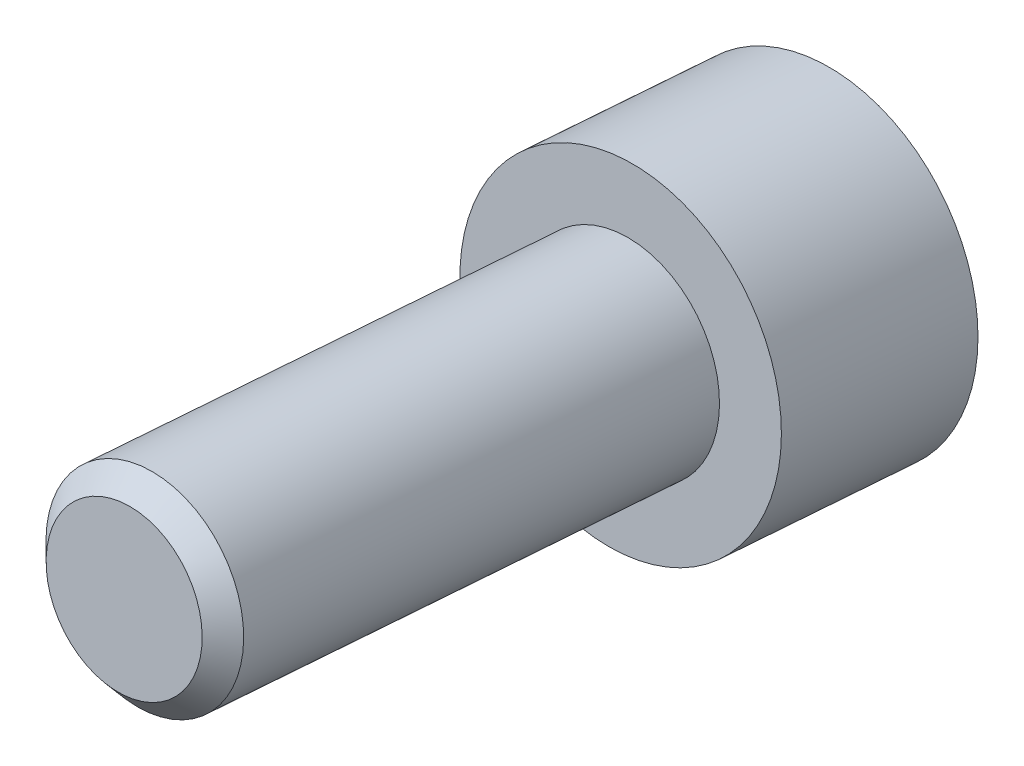
ISO-10303-21;
HEADER;
FILE_DESCRIPTION(('STEP AP214'),'2;1');
FILE_NAME('part.step','',(''),(''),'','','');
FILE_SCHEMA(('AUTOMOTIVE_DESIGN { 1 0 10303 214 1 1 1 1 }'));
ENDSEC;
DATA;
#1=APPLICATION_CONTEXT('core data for automotive mechanical design processes');
#2=APPLICATION_PROTOCOL_DEFINITION('international standard','automotive_design',2000,#1);
#3=PRODUCT_CONTEXT('',#1,'mechanical');
#4=PRODUCT('Part','Part','',(#3));
#5=PRODUCT_RELATED_PRODUCT_CATEGORY('part','',(#4));
#6=PRODUCT_DEFINITION_FORMATION('','',#4);
#7=PRODUCT_DEFINITION_CONTEXT('part definition',#1,'design');
#8=PRODUCT_DEFINITION('design','',#6,#7);
#9=PRODUCT_DEFINITION_SHAPE('','',#8);
#10=(LENGTH_UNIT() NAMED_UNIT(*) SI_UNIT(.MILLI.,.METRE.));
#11=(NAMED_UNIT(*) PLANE_ANGLE_UNIT() SI_UNIT($,.RADIAN.));
#12=(NAMED_UNIT(*) SI_UNIT($,.STERADIAN.) SOLID_ANGLE_UNIT());
#13=UNCERTAINTY_MEASURE_WITH_UNIT(LENGTH_MEASURE(1.E-05),#10,'distance_accuracy_value','');
#14=(GEOMETRIC_REPRESENTATION_CONTEXT(3) GLOBAL_UNCERTAINTY_ASSIGNED_CONTEXT((#13)) GLOBAL_UNIT_ASSIGNED_CONTEXT((#10,
#11,#12)) REPRESENTATION_CONTEXT('',''));
#15=CARTESIAN_POINT('',(0.,0.,0.));
#16=DIRECTION('',(0.,0.,1.));
#17=DIRECTION('',(1.,0.,0.));
#18=AXIS2_PLACEMENT_3D('',#15,#16,#17);
#19=CARTESIAN_POINT('',(-13.0881387525545,28.3949735281638,-38.8736341053796));
#20=DIRECTION('',(0.,-0.0739396993188504,-0.997262714065175));
#21=DIRECTION('',(0.,0.997262714065175,-0.0739396993188504));
#22=AXIS2_PLACEMENT_3D('',#19,#20,#21);
#23=PLANE('',#22);
#24=DIRECTION('',(0.191716471391777,-0.978763842343136,0.0725681439668081));
#25=VECTOR('',#24,1.);
#26=CARTESIAN_POINT('',(-12.8684931328905,27.2736239169617,-38.7904942748071));
#27=LINE('',#26,#25);
#28=CARTESIAN_POINT('',(-12.8684931328905,27.2736239169617,-38.7904942748071));
#29=VERTEX_POINT('',#28);
#30=CARTESIAN_POINT('',(-12.6488475132264,26.1522743057596,-38.7073544442347));
#31=VERTEX_POINT('',#30);
#32=EDGE_CURVE('E68',#29,#31,#27,.T.);
#33=ORIENTED_EDGE('',*,*,#32,.T.);
#34=DIRECTION('',(-0.754102702199386,-0.654958780483957,0.0485603789374805));
#35=VECTOR('',#34,1.);
#36=CARTESIAN_POINT('',(-12.6488475132264,26.1522743057596,-38.7073544442347));
#37=LINE('',#36,#35);
#38=CARTESIAN_POINT('',(-13.5128074751038,25.4019014966345,-38.6517198164668));
#39=VERTEX_POINT('',#38);
#40=EDGE_CURVE('E91',#31,#39,#37,.T.);
#41=ORIENTED_EDGE('',*,*,#40,.T.);
#42=DIRECTION('',(-0.945819173591162,0.323805061859179,-0.0240077650293393));
#43=VECTOR('',#42,1.);
#44=CARTESIAN_POINT('',(-13.5128074751038,25.4019014966345,-38.6517198164668));
#45=LINE('',#44,#43);
#46=CARTESIAN_POINT('',(-14.5964130566453,25.7728782987115,-38.6792250192715));
#47=VERTEX_POINT('',#46);
#48=EDGE_CURVE('E130',#39,#47,#45,.T.);
#49=ORIENTED_EDGE('',*,*,#48,.T.);
#50=DIRECTION('',(-0.191716471391775,0.978763842343137,-0.0725681439667963));
#51=VECTOR('',#50,1.);
#52=CARTESIAN_POINT('',(-14.5964130566453,25.7728782987115,-38.6792250192715));
#53=LINE('',#52,#51);
#54=CARTESIAN_POINT('',(-14.8160586763093,26.8942279099136,-38.7623648498439));
#55=VERTEX_POINT('',#54);
#56=EDGE_CURVE('E125',#47,#55,#53,.T.);
#57=ORIENTED_EDGE('',*,*,#56,.T.);
#58=DIRECTION('',(0.754102702199386,0.654958780483956,-0.0485603789374928));
#59=VECTOR('',#58,1.);
#60=CARTESIAN_POINT('',(-14.8160586763093,26.8942279099136,-38.7623648498439));
#61=LINE('',#60,#59);
#62=CARTESIAN_POINT('',(-13.9520987144319,27.6446007190387,-38.8179994776117));
#63=VERTEX_POINT('',#62);
#64=EDGE_CURVE('E74',#55,#63,#61,.T.);
#65=ORIENTED_EDGE('',*,*,#64,.T.);
#66=DIRECTION('',(0.945819173591162,-0.323805061859179,0.0240077650293395));
#67=VECTOR('',#66,1.);
#68=CARTESIAN_POINT('',(-13.9520987144319,27.6446007190387,-38.8179994776117));
#69=LINE('',#68,#67);
#70=EDGE_CURVE('E71',#63,#29,#69,.T.);
#71=ORIENTED_EDGE('',*,*,#70,.T.);
#72=EDGE_LOOP('',(#33,#41,#49,#57,#65,#71));
#73=FACE_BOUND('',#72,.T.);
#74=ADVANCED_FACE('F17',(#73),#23,.T.);
#75=CARTESIAN_POINT('',(-13.9520987144319,27.6446007190387,-38.8179994776117));
#76=DIRECTION('',(0.324693841745312,0.943230196070403,-0.0699335853053339));
#77=DIRECTION('',(-0.945545222080467,0.325490757166468,0.));
#78=AXIS2_PLACEMENT_3D('',#75,#76,#77);
#79=PLANE('',#78);
#80=ORIENTED_EDGE('',*,*,#70,.F.);
#81=DIRECTION('',(0.,-0.0739396993188526,-0.997262714065175));
#82=VECTOR('',#81,1.);
#83=CARTESIAN_POINT('',(-13.9520987144319,27.6446007190387,-38.8179994776117));
#84=LINE('',#83,#82);
#85=CARTESIAN_POINT('',(-13.9520987144319,27.5712386736208,-39.8074710767233));
#86=VERTEX_POINT('',#85);
#87=EDGE_CURVE('E120',#63,#86,#84,.T.);
#88=ORIENTED_EDGE('',*,*,#87,.T.);
#89=DIRECTION('',(0.945819173591165,-0.323805061859173,0.0240077650293274));
#90=VECTOR('',#89,1.);
#91=CARTESIAN_POINT('',(-13.9520987144319,27.5712386736208,-39.8074710767233));
#92=LINE('',#91,#90);
#93=CARTESIAN_POINT('',(-12.8684931328905,27.2002618715438,-39.7799658739186));
#94=VERTEX_POINT('',#93);
#95=EDGE_CURVE('E82',#86,#94,#92,.T.);
#96=ORIENTED_EDGE('',*,*,#95,.T.);
#97=DIRECTION('',(0.,0.0739396993188516,0.997262714065175));
#98=VECTOR('',#97,1.);
#99=CARTESIAN_POINT('',(-12.8684931328905,27.2002618715438,-39.7799658739186));
#100=LINE('',#99,#98);
#101=EDGE_CURVE('E77',#94,#29,#100,.T.);
#102=ORIENTED_EDGE('',*,*,#101,.T.);
#103=EDGE_LOOP('',(#80,#88,#96,#102));
#104=FACE_BOUND('',#103,.T.);
#105=ADVANCED_FACE('F80',(#104),#79,.F.);
#106=CARTESIAN_POINT('',(-12.8684931328905,27.2736239169617,-38.7904942748071));
#107=DIRECTION('',(0.981450352589007,0.191191688591161,-0.0141754582491781));
#108=DIRECTION('',(-0.191210900861329,0.981548975544164,0.));
#109=AXIS2_PLACEMENT_3D('',#106,#107,#108);
#110=PLANE('',#109);
#111=ORIENTED_EDGE('',*,*,#32,.F.);
#112=ORIENTED_EDGE('',*,*,#101,.F.);
#113=DIRECTION('',(0.191716471391777,-0.978763842343135,0.0725681439668141));
#114=VECTOR('',#113,1.);
#115=CARTESIAN_POINT('',(-12.8684931328905,27.2002618715438,-39.7799658739186));
#116=LINE('',#115,#114);
#117=CARTESIAN_POINT('',(-12.6488475132264,26.0789122603417,-39.6968260433462));
#118=VERTEX_POINT('',#117);
#119=EDGE_CURVE('E117',#94,#118,#116,.T.);
#120=ORIENTED_EDGE('',*,*,#119,.T.);
#121=DIRECTION('',(0.,0.0739396993188511,0.997262714065175));
#122=VECTOR('',#121,1.);
#123=CARTESIAN_POINT('',(-12.6488475132264,26.0789122603417,-39.6968260433462));
#124=LINE('',#123,#122);
#125=EDGE_CURVE('E88',#118,#31,#124,.T.);
#126=ORIENTED_EDGE('',*,*,#125,.T.);
#127=EDGE_LOOP('',(#111,#112,#120,#126));
#128=FACE_BOUND('',#127,.T.);
#129=ADVANCED_FACE('F86',(#128),#110,.F.);
#130=CARTESIAN_POINT('',(-12.6488475132264,26.1522743057596,-38.7073544442347));
#131=DIRECTION('',(0.656756510843695,-0.752038507479242,0.0557581270561558));
#132=DIRECTION('',(0.753210272526696,0.657779815257552,0.));
#133=AXIS2_PLACEMENT_3D('',#130,#131,#132);
#134=PLANE('',#133);
#135=ORIENTED_EDGE('',*,*,#40,.F.);
#136=ORIENTED_EDGE('',*,*,#125,.F.);
#137=DIRECTION('',(-0.754102702199384,-0.654958780483959,0.0485603789374805));
#138=VECTOR('',#137,1.);
#139=CARTESIAN_POINT('',(-12.6488475132264,26.0789122603417,-39.6968260433462));
#140=LINE('',#139,#138);
#141=CARTESIAN_POINT('',(-13.5128074751038,25.3285394512166,-39.6411914155784));
#142=VERTEX_POINT('',#141);
#143=EDGE_CURVE('E115',#118,#142,#140,.T.);
#144=ORIENTED_EDGE('',*,*,#143,.T.);
#145=DIRECTION('',(0.,0.0739396993188516,0.997262714065175));
#146=VECTOR('',#145,1.);
#147=CARTESIAN_POINT('',(-13.5128074751038,25.3285394512166,-39.6411914155784));
#148=LINE('',#147,#146);
#149=EDGE_CURVE('E132',#142,#39,#148,.T.);
#150=ORIENTED_EDGE('',*,*,#149,.T.);
#151=EDGE_LOOP('',(#135,#136,#144,#150));
#152=FACE_BOUND('',#151,.T.);
#153=ADVANCED_FACE('F137',(#152),#134,.F.);
#154=CARTESIAN_POINT('',(-13.5128074751038,25.4019014966345,-38.6517198164668));
#155=DIRECTION('',(-0.324693841745313,-0.943230196070403,0.0699335853053339));
#156=DIRECTION('',(0.945545222080467,-0.325490757166469,0.));
#157=AXIS2_PLACEMENT_3D('',#154,#155,#156);
#158=PLANE('',#157);
#159=ORIENTED_EDGE('',*,*,#48,.F.);
#160=ORIENTED_EDGE('',*,*,#149,.F.);
#161=DIRECTION('',(-0.945819173591161,0.323805061859184,-0.0240077650293333));
#162=VECTOR('',#161,1.);
#163=CARTESIAN_POINT('',(-13.5128074751038,25.3285394512166,-39.6411914155784));
#164=LINE('',#163,#162);
#165=CARTESIAN_POINT('',(-14.5964130566453,25.6995162532936,-39.668696618383));
#166=VERTEX_POINT('',#165);
#167=EDGE_CURVE('E111',#142,#166,#164,.T.);
#168=ORIENTED_EDGE('',*,*,#167,.T.);
#169=DIRECTION('',(0.,0.0739396993188521,0.997262714065175));
#170=VECTOR('',#169,1.);
#171=CARTESIAN_POINT('',(-14.5964130566453,25.6995162532936,-39.668696618383));
#172=LINE('',#171,#170);
#173=EDGE_CURVE('E127',#166,#47,#172,.T.);
#174=ORIENTED_EDGE('',*,*,#173,.T.);
#175=EDGE_LOOP('',(#159,#160,#168,#174));
#176=FACE_BOUND('',#175,.T.);
#177=ADVANCED_FACE('F141',(#176),#158,.F.);
#178=CARTESIAN_POINT('',(-14.5964130566453,25.7728782987115,-38.6792250192715));
#179=DIRECTION('',(-0.981450352589007,-0.191191688591161,0.0141754582491781));
#180=DIRECTION('',(0.191210900861329,-0.981548975544165,0.));
#181=AXIS2_PLACEMENT_3D('',#178,#179,#180);
#182=PLANE('',#181);
#183=ORIENTED_EDGE('',*,*,#56,.F.);
#184=ORIENTED_EDGE('',*,*,#173,.F.);
#185=DIRECTION('',(-0.191716471391775,0.978763842343136,-0.0725681439668137));
#186=VECTOR('',#185,1.);
#187=CARTESIAN_POINT('',(-14.5964130566453,25.6995162532936,-39.668696618383));
#188=LINE('',#187,#186);
#189=CARTESIAN_POINT('',(-14.8160586763093,26.8208658644957,-39.7518364489554));
#190=VERTEX_POINT('',#189);
#191=EDGE_CURVE('E35',#166,#190,#188,.T.);
#192=ORIENTED_EDGE('',*,*,#191,.T.);
#193=DIRECTION('',(0.,0.0739396993188471,0.997262714065175));
#194=VECTOR('',#193,1.);
#195=CARTESIAN_POINT('',(-14.8160586763093,26.8208658644957,-39.7518364489554));
#196=LINE('',#195,#194);
#197=EDGE_CURVE('E123',#190,#55,#196,.T.);
#198=ORIENTED_EDGE('',*,*,#197,.T.);
#199=EDGE_LOOP('',(#183,#184,#192,#198));
#200=FACE_BOUND('',#199,.T.);
#201=ADVANCED_FACE('F143',(#200),#182,.F.);
#202=CARTESIAN_POINT('',(-14.8160586763093,26.8942279099136,-38.7623648498439));
#203=DIRECTION('',(-0.656756510843694,0.752038507479243,-0.0557581270561558));
#204=DIRECTION('',(-0.753210272526697,-0.657779815257552,0.));
#205=AXIS2_PLACEMENT_3D('',#202,#203,#204);
#206=PLANE('',#205);
#207=ORIENTED_EDGE('',*,*,#64,.F.);
#208=ORIENTED_EDGE('',*,*,#197,.F.);
#209=DIRECTION('',(0.754102702199393,0.654958780483949,-0.048560378937475));
#210=VECTOR('',#209,1.);
#211=CARTESIAN_POINT('',(-14.8160586763093,26.8208658644957,-39.7518364489554));
#212=LINE('',#211,#210);
#213=EDGE_CURVE('E104',#190,#86,#212,.T.);
#214=ORIENTED_EDGE('',*,*,#213,.T.);
#215=ORIENTED_EDGE('',*,*,#87,.F.);
#216=EDGE_LOOP('',(#207,#208,#214,#215));
#217=FACE_BOUND('',#216,.T.);
#218=ADVANCED_FACE('F144',(#217),#206,.F.);
#219=CARTESIAN_POINT('',(-13.7324530947679,26.4498890624187,-39.7243312461508));
#220=DIRECTION('',(0.,0.0739396993188504,0.997262714065175));
#221=DIRECTION('',(0.,-0.997262714065175,0.0739396993188504));
#222=AXIS2_PLACEMENT_3D('',#219,#220,#221);
#223=PLANE('',#222);
#224=ORIENTED_EDGE('',*,*,#191,.F.);
#225=ORIENTED_EDGE('',*,*,#167,.F.);
#226=ORIENTED_EDGE('',*,*,#143,.F.);
#227=ORIENTED_EDGE('',*,*,#119,.F.);
#228=ORIENTED_EDGE('',*,*,#95,.F.);
#229=ORIENTED_EDGE('',*,*,#213,.F.);
#230=EDGE_LOOP('',(#224,#225,#226,#227,#228,#229));
#231=FACE_BOUND('',#230,.T.);
#232=CARTESIAN_POINT('',(-13.7324530947679,26.4498890624187,-39.7243312461508));
#233=DIRECTION('',(0.,0.0739396993188517,0.997262714065174));
#234=DIRECTION('',(0.,-0.997262714065174,0.0739396993188517));
#235=AXIS2_PLACEMENT_3D('',#232,#233,#234);
#236=CIRCLE('',#235,2.0447);
#237=CARTESIAN_POINT('',(-13.7324530947679,24.4107859909696,-39.5731467429536));
#238=VERTEX_POINT('',#237);
#239=EDGE_CURVE('E20',#238,#238,#236,.T.);
#240=ORIENTED_EDGE('',*,*,#239,.F.);
#241=EDGE_LOOP('',(#240));
#242=FACE_BOUND('',#241,.T.);
#243=ADVANCED_FACE('F146',(#231,#242),#223,.F.);
#244=CARTESIAN_POINT('',(-13.7324530947679,25.3587313436907,-54.4413360226962));
#245=DIRECTION('',(0.,0.0739396993188517,0.997262714065174));
#246=DIRECTION('',(0.,-0.997262714065174,0.0739396993188517));
#247=AXIS2_PLACEMENT_3D('',#244,#245,#246);
#248=CYLINDRICAL_SURFACE('',#247,2.0447);
#249=ORIENTED_EDGE('',*,*,#239,.T.);
#250=EDGE_LOOP('',(#249));
#251=FACE_BOUND('',#250,.T.);
#252=CARTESIAN_POINT('',(-13.7324530947679,26.6358178303259,-37.2166144253625));
#253=DIRECTION('',(0.,0.0739396993188517,0.997262714065174));
#254=DIRECTION('',(0.,-0.997262714065174,0.0739396993188517));
#255=AXIS2_PLACEMENT_3D('',#252,#253,#254);
#256=CIRCLE('',#255,2.0447);
#257=CARTESIAN_POINT('',(-13.7324530947679,24.5967147588768,-37.0654299221653));
#258=VERTEX_POINT('',#257);
#259=EDGE_CURVE('E99',#258,#258,#256,.F.);
#260=ORIENTED_EDGE('',*,*,#259,.T.);
#261=EDGE_LOOP('',(#260));
#262=FACE_BOUND('',#261,.T.);
#263=ADVANCED_FACE('F153',(#251,#262),#248,.T.);
#264=CARTESIAN_POINT('',(-13.922773231193,28.0769701000253,-30.9560357970336));
#265=DIRECTION('',(0.,-0.0739396993188504,-0.997262714065175));
#266=DIRECTION('',(0.,0.997262714065175,-0.0739396993188504));
#267=AXIS2_PLACEMENT_3D('',#264,#265,#266);
#268=PLANE('',#267);
#269=CARTESIAN_POINT('',(-13.7324530947679,27.1053349209961,-30.8839961911092));
#270=DIRECTION('',(0.,-0.0739396993188507,-0.997262714065175));
#271=DIRECTION('',(0.,0.997262714065174,-0.0739396993188507));
#272=AXIS2_PLACEMENT_3D('',#269,#270,#271);
#273=CIRCLE('',#272,0.992716666692805);
#274=CARTESIAN_POINT('',(-13.7324530947679,28.0953342383199,-30.9573973629532));
#275=VERTEX_POINT('',#274);
#276=EDGE_CURVE('E97',#275,#275,#273,.T.);
#277=ORIENTED_EDGE('',*,*,#276,.F.);
#278=EDGE_LOOP('',(#277));
#279=FACE_BOUND('',#278,.T.);
#280=ADVANCED_FACE('F172',(#279),#268,.F.);
#281=CARTESIAN_POINT('',(-14.1244557638226,28.6370962587649,-37.3649945093315));
#282=DIRECTION('',(0.,-0.0739396993188504,-0.997262714065175));
#283=DIRECTION('',(0.,0.997262714065175,-0.0739396993188504));
#284=AXIS2_PLACEMENT_3D('',#281,#282,#283);
#285=PLANE('',#284);
#286=CARTESIAN_POINT('',(-13.7324530947679,26.6358178303259,-37.2166144253625));
#287=DIRECTION('',(0.,0.0739396993188497,0.997262714065175));
#288=DIRECTION('',(0.,-0.997262714065175,0.0739396993188497));
#289=AXIS2_PLACEMENT_3D('',#286,#287,#288);
#290=CIRCLE('',#289,1.2573);
#291=CARTESIAN_POINT('',(-13.7324530947679,25.3819594199317,-37.1236500414089));
#292=VERTEX_POINT('',#291);
#293=EDGE_CURVE('E26',#292,#292,#290,.T.);
#294=ORIENTED_EDGE('',*,*,#293,.F.);
#295=EDGE_LOOP('',(#294));
#296=FACE_BOUND('',#295,.T.);
#297=ORIENTED_EDGE('',*,*,#259,.F.);
#298=EDGE_LOOP('',(#297));
#299=FACE_BOUND('',#298,.T.);
#300=ADVANCED_FACE('F165',(#296,#299),#285,.F.);
#301=CARTESIAN_POINT('',(-13.7324530947679,27.0857717088897,-31.1478552841371));
#302=DIRECTION('',(0.,-0.0739396993188507,-0.997262714065175));
#303=DIRECTION('',(0.,0.997262714065174,-0.0739396993188507));
#304=AXIS2_PLACEMENT_3D('',#301,#302,#303);
#305=CONICAL_SURFACE('',#304,1.25729999992151,0.785398163329456);
#306=ORIENTED_EDGE('',*,*,#276,.T.);
#307=EDGE_LOOP('',(#306));
#308=FACE_BOUND('',#307,.T.);
#309=CARTESIAN_POINT('',(-13.7324530947679,27.0857717088891,-31.1478552841451));
#310=DIRECTION('',(0.,0.0739396993188497,0.997262714065175));
#311=DIRECTION('',(0.,-0.997262714065175,0.0739396993188497));
#312=AXIS2_PLACEMENT_3D('',#309,#310,#311);
#313=CIRCLE('',#312,1.2573);
#314=CARTESIAN_POINT('',(-13.7324530947679,25.831913298495,-31.0548909001915));
#315=VERTEX_POINT('',#314);
#316=EDGE_CURVE('E11',#315,#315,#313,.F.);
#317=ORIENTED_EDGE('',*,*,#316,.F.);
#318=EDGE_LOOP('',(#317));
#319=FACE_BOUND('',#318,.T.);
#320=ADVANCED_FACE('F159',(#308,#319),#305,.T.);
#321=CARTESIAN_POINT('',(-13.7324530947679,25.3587313436907,-54.4413360226962));
#322=DIRECTION('',(0.,0.0739396993188497,0.997262714065175));
#323=DIRECTION('',(0.,-0.997262714065175,0.0739396993188497));
#324=AXIS2_PLACEMENT_3D('',#321,#322,#323);
#325=CYLINDRICAL_SURFACE('',#324,1.2573);
#326=ORIENTED_EDGE('',*,*,#293,.T.);
#327=EDGE_LOOP('',(#326));
#328=FACE_BOUND('',#327,.T.);
#329=ORIENTED_EDGE('',*,*,#316,.T.);
#330=EDGE_LOOP('',(#329));
#331=FACE_BOUND('',#330,.T.);
#332=ADVANCED_FACE('F157',(#328,#331),#325,.T.);
#333=CLOSED_SHELL('',(#74,#105,#129,#153,#177,#201,#218,#243,#263,#280,#300,#320,#332));
#334=MANIFOLD_SOLID_BREP('B1',#333);
#335=ADVANCED_BREP_SHAPE_REPRESENTATION('',(#18,#334),#14);
#336=SHAPE_DEFINITION_REPRESENTATION(#9,#335);
ENDSEC;
END-ISO-10303-21;
